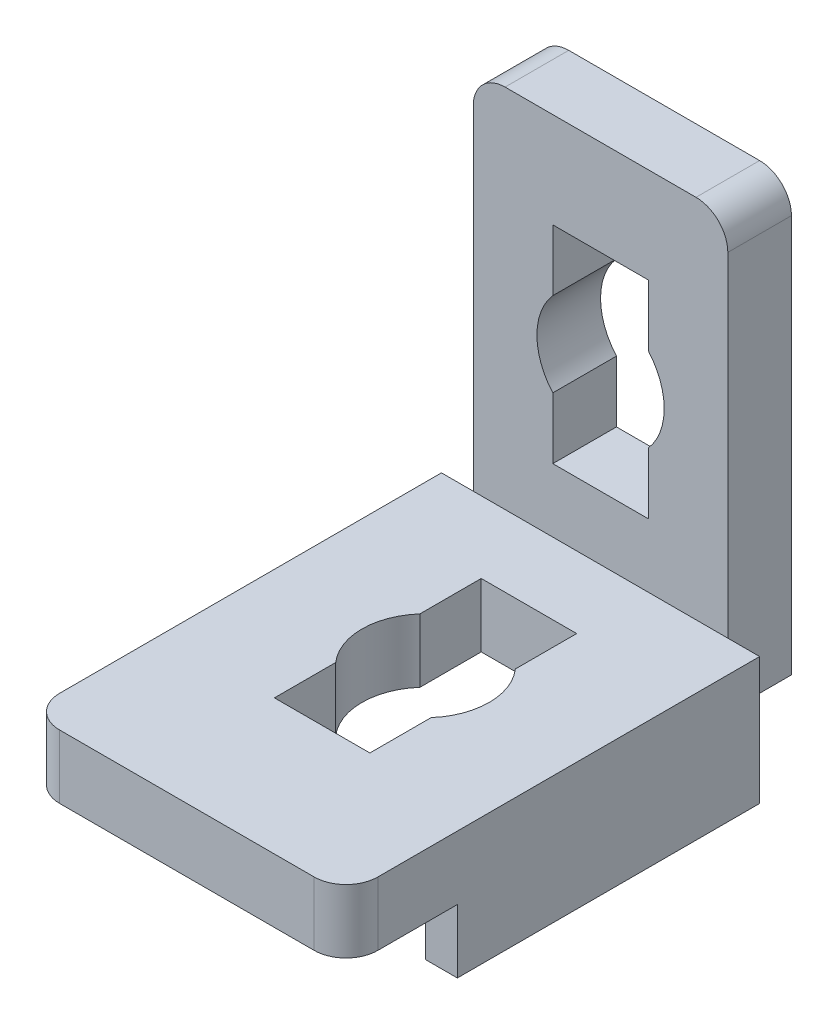
ISO-10303-21;
HEADER;
FILE_DESCRIPTION(('STEP AP214'),'2;1');
FILE_NAME('part.step','',(''),(''),'','','');
FILE_SCHEMA(('AUTOMOTIVE_DESIGN { 1 0 10303 214 1 1 1 1 }'));
ENDSEC;
DATA;
#1=APPLICATION_CONTEXT('core data for automotive mechanical design processes');
#2=APPLICATION_PROTOCOL_DEFINITION('international standard','automotive_design',2000,#1);
#3=PRODUCT_CONTEXT('',#1,'mechanical');
#4=PRODUCT('Part','Part','',(#3));
#5=PRODUCT_RELATED_PRODUCT_CATEGORY('part','',(#4));
#6=PRODUCT_DEFINITION_FORMATION('','',#4);
#7=PRODUCT_DEFINITION_CONTEXT('part definition',#1,'design');
#8=PRODUCT_DEFINITION('design','',#6,#7);
#9=PRODUCT_DEFINITION_SHAPE('','',#8);
#10=(LENGTH_UNIT() NAMED_UNIT(*) SI_UNIT(.MILLI.,.METRE.));
#11=(NAMED_UNIT(*) PLANE_ANGLE_UNIT() SI_UNIT($,.RADIAN.));
#12=(NAMED_UNIT(*) SI_UNIT($,.STERADIAN.) SOLID_ANGLE_UNIT());
#13=UNCERTAINTY_MEASURE_WITH_UNIT(LENGTH_MEASURE(1.E-05),#10,'distance_accuracy_value','');
#14=(GEOMETRIC_REPRESENTATION_CONTEXT(3) GLOBAL_UNCERTAINTY_ASSIGNED_CONTEXT((#13)) GLOBAL_UNIT_ASSIGNED_CONTEXT((#10,
#11,#12)) REPRESENTATION_CONTEXT('',''));
#15=CARTESIAN_POINT('',(0.,0.,0.));
#16=DIRECTION('',(0.,0.,1.));
#17=DIRECTION('',(1.,0.,0.));
#18=AXIS2_PLACEMENT_3D('',#15,#16,#17);
#19=CARTESIAN_POINT('',(-4.,0.,2.));
#20=DIRECTION('',(0.,1.,0.));
#21=DIRECTION('',(0.,0.,1.));
#22=AXIS2_PLACEMENT_3D('',#19,#20,#21);
#23=PLANE('',#22);
#24=DIRECTION('',(0.,0.,1.));
#25=VECTOR('',#24,1.);
#26=CARTESIAN_POINT('',(1.5,0.,8.82287565553229));
#27=LINE('',#26,#25);
#28=CARTESIAN_POINT('',(1.5,0.,8.82287565553229));
#29=VERTEX_POINT('',#28);
#30=CARTESIAN_POINT('',(1.5,0.,10.75));
#31=VERTEX_POINT('',#30);
#32=EDGE_CURVE('E343',#29,#31,#27,.T.);
#33=ORIENTED_EDGE('',*,*,#32,.F.);
#34=CARTESIAN_POINT('',(0.,0.,7.5));
#35=DIRECTION('',(0.,-1.,0.));
#36=DIRECTION('',(0.,0.,-1.));
#37=AXIS2_PLACEMENT_3D('',#34,#35,#36);
#38=CIRCLE('',#37,2.);
#39=CARTESIAN_POINT('',(1.5,0.,6.17712434446771));
#40=VERTEX_POINT('',#39);
#41=EDGE_CURVE('E341',#40,#29,#38,.T.);
#42=ORIENTED_EDGE('',*,*,#41,.F.);
#43=DIRECTION('',(0.,0.,1.));
#44=VECTOR('',#43,1.);
#45=CARTESIAN_POINT('',(1.5,0.,4.25));
#46=LINE('',#45,#44);
#47=CARTESIAN_POINT('',(1.5,0.,4.25));
#48=VERTEX_POINT('',#47);
#49=EDGE_CURVE('E361',#48,#40,#46,.T.);
#50=ORIENTED_EDGE('',*,*,#49,.F.);
#51=DIRECTION('',(1.,0.,0.));
#52=VECTOR('',#51,1.);
#53=CARTESIAN_POINT('',(-1.5,0.,4.25));
#54=LINE('',#53,#52);
#55=CARTESIAN_POINT('',(-1.5,0.,4.25));
#56=VERTEX_POINT('',#55);
#57=EDGE_CURVE('E358',#56,#48,#54,.T.);
#58=ORIENTED_EDGE('',*,*,#57,.F.);
#59=DIRECTION('',(0.,0.,-1.));
#60=VECTOR('',#59,1.);
#61=CARTESIAN_POINT('',(-1.5,0.,4.25));
#62=LINE('',#61,#60);
#63=CARTESIAN_POINT('',(-1.5,0.,6.1771243444677));
#64=VERTEX_POINT('',#63);
#65=EDGE_CURVE('E355',#64,#56,#62,.T.);
#66=ORIENTED_EDGE('',*,*,#65,.F.);
#67=CARTESIAN_POINT('',(0.,0.,7.5));
#68=DIRECTION('',(0.,-1.,0.));
#69=DIRECTION('',(0.,0.,-1.));
#70=AXIS2_PLACEMENT_3D('',#67,#68,#69);
#71=CIRCLE('',#70,2.);
#72=CARTESIAN_POINT('',(-1.5,0.,8.8228756555323));
#73=VERTEX_POINT('',#72);
#74=EDGE_CURVE('E352',#73,#64,#71,.T.);
#75=ORIENTED_EDGE('',*,*,#74,.F.);
#76=DIRECTION('',(0.,0.,-1.));
#77=VECTOR('',#76,1.);
#78=CARTESIAN_POINT('',(-1.5,0.,8.8228756555323));
#79=LINE('',#78,#77);
#80=CARTESIAN_POINT('',(-1.5,0.,10.75));
#81=VERTEX_POINT('',#80);
#82=EDGE_CURVE('E349',#81,#73,#79,.T.);
#83=ORIENTED_EDGE('',*,*,#82,.F.);
#84=DIRECTION('',(-1.,0.,0.));
#85=VECTOR('',#84,1.);
#86=CARTESIAN_POINT('',(-1.5,0.,10.75));
#87=LINE('',#86,#85);
#88=EDGE_CURVE('E346',#31,#81,#87,.T.);
#89=ORIENTED_EDGE('',*,*,#88,.F.);
#90=EDGE_LOOP('',(#33,#42,#50,#58,#66,#75,#83,#89));
#91=FACE_BOUND('',#90,.T.);
#92=DIRECTION('',(-1.,0.,0.));
#93=VECTOR('',#92,1.);
#94=CARTESIAN_POINT('',(-5.,0.,15.));
#95=LINE('',#94,#93);
#96=CARTESIAN_POINT('',(4.,0.,15.));
#97=VERTEX_POINT('',#96);
#98=CARTESIAN_POINT('',(-4.,0.,15.));
#99=VERTEX_POINT('',#98);
#100=EDGE_CURVE('E447',#97,#99,#95,.T.);
#101=ORIENTED_EDGE('',*,*,#100,.T.);
#102=CARTESIAN_POINT('',(-4.,0.,14.));
#103=DIRECTION('',(0.,1.,0.));
#104=DIRECTION('',(0.,0.,1.));
#105=AXIS2_PLACEMENT_3D('',#102,#103,#104);
#106=CIRCLE('',#105,1.);
#107=CARTESIAN_POINT('',(-5.,0.,14.));
#108=VERTEX_POINT('',#107);
#109=EDGE_CURVE('E558',#99,#108,#106,.F.);
#110=ORIENTED_EDGE('',*,*,#109,.T.);
#111=DIRECTION('',(0.,0.,-1.));
#112=VECTOR('',#111,1.);
#113=CARTESIAN_POINT('',(-5.,0.,2.));
#114=LINE('',#113,#112);
#115=CARTESIAN_POINT('',(-5.,0.,11.5));
#116=VERTEX_POINT('',#115);
#117=EDGE_CURVE('E443',#108,#116,#114,.T.);
#118=ORIENTED_EDGE('',*,*,#117,.T.);
#119=DIRECTION('',(-1.,0.,0.));
#120=VECTOR('',#119,1.);
#121=CARTESIAN_POINT('',(-5.,0.,11.5));
#122=LINE('',#121,#120);
#123=CARTESIAN_POINT('',(-4.,0.,11.5));
#124=VERTEX_POINT('',#123);
#125=EDGE_CURVE('E414',#124,#116,#122,.T.);
#126=ORIENTED_EDGE('',*,*,#125,.F.);
#127=DIRECTION('',(0.,0.,1.));
#128=VECTOR('',#127,1.);
#129=CARTESIAN_POINT('',(-4.,0.,2.));
#130=LINE('',#129,#128);
#131=CARTESIAN_POINT('',(-4.,0.,2.));
#132=VERTEX_POINT('',#131);
#133=EDGE_CURVE('E409',#132,#124,#130,.T.);
#134=ORIENTED_EDGE('',*,*,#133,.F.);
#135=DIRECTION('',(0.,0.,-1.));
#136=VECTOR('',#135,1.);
#137=CARTESIAN_POINT('',(-4.,0.,2.));
#138=LINE('',#137,#136);
#139=CARTESIAN_POINT('',(-4.,0.,0.));
#140=VERTEX_POINT('',#139);
#141=EDGE_CURVE('E431',#132,#140,#138,.T.);
#142=ORIENTED_EDGE('',*,*,#141,.T.);
#143=DIRECTION('',(1.,0.,0.));
#144=VECTOR('',#143,1.);
#145=CARTESIAN_POINT('',(-4.,0.,0.));
#146=LINE('',#145,#144);
#147=CARTESIAN_POINT('',(4.,0.,0.));
#148=VERTEX_POINT('',#147);
#149=EDGE_CURVE('E475',#140,#148,#146,.T.);
#150=ORIENTED_EDGE('',*,*,#149,.T.);
#151=DIRECTION('',(0.,0.,-1.));
#152=VECTOR('',#151,1.);
#153=CARTESIAN_POINT('',(4.,0.,2.));
#154=LINE('',#153,#152);
#155=CARTESIAN_POINT('',(4.,0.,2.));
#156=VERTEX_POINT('',#155);
#157=EDGE_CURVE('E473',#156,#148,#154,.T.);
#158=ORIENTED_EDGE('',*,*,#157,.F.);
#159=DIRECTION('',(0.,0.,-1.));
#160=VECTOR('',#159,1.);
#161=CARTESIAN_POINT('',(4.,0.,2.));
#162=LINE('',#161,#160);
#163=CARTESIAN_POINT('',(4.,0.,11.5));
#164=VERTEX_POINT('',#163);
#165=EDGE_CURVE('E389',#164,#156,#162,.T.);
#166=ORIENTED_EDGE('',*,*,#165,.F.);
#167=DIRECTION('',(-1.,0.,0.));
#168=VECTOR('',#167,1.);
#169=CARTESIAN_POINT('',(5.,0.,11.5));
#170=LINE('',#169,#168);
#171=CARTESIAN_POINT('',(5.,0.,11.5));
#172=VERTEX_POINT('',#171);
#173=EDGE_CURVE('E384',#172,#164,#170,.T.);
#174=ORIENTED_EDGE('',*,*,#173,.F.);
#175=DIRECTION('',(0.,0.,1.));
#176=VECTOR('',#175,1.);
#177=CARTESIAN_POINT('',(5.,0.,2.));
#178=LINE('',#177,#176);
#179=CARTESIAN_POINT('',(5.,0.,14.));
#180=VERTEX_POINT('',#179);
#181=EDGE_CURVE('E508',#172,#180,#178,.T.);
#182=ORIENTED_EDGE('',*,*,#181,.T.);
#183=CARTESIAN_POINT('',(4.,0.,14.));
#184=DIRECTION('',(0.,1.,0.));
#185=DIRECTION('',(0.,0.,1.));
#186=AXIS2_PLACEMENT_3D('',#183,#184,#185);
#187=CIRCLE('',#186,1.);
#188=EDGE_CURVE('E442',#180,#97,#187,.F.);
#189=ORIENTED_EDGE('',*,*,#188,.T.);
#190=EDGE_LOOP('',(#101,#110,#118,#126,#134,#142,#150,#158,#166,#174,#182,#189));
#191=FACE_BOUND('',#190,.T.);
#192=ADVANCED_FACE('F34',(#91,#191),#23,.F.);
#193=CARTESIAN_POINT('',(-4.,0.,2.));
#194=DIRECTION('',(1.,0.,0.));
#195=DIRECTION('',(0.,0.,-1.));
#196=AXIS2_PLACEMENT_3D('',#193,#194,#195);
#197=PLANE('',#196);
#198=DIRECTION('',(0.,-1.,0.));
#199=VECTOR('',#198,1.);
#200=CARTESIAN_POINT('',(-4.,0.,2.));
#201=LINE('',#200,#199);
#202=CARTESIAN_POINT('',(-4.,12.5,2.));
#203=VERTEX_POINT('',#202);
#204=CARTESIAN_POINT('',(-4.,2.,2.));
#205=VERTEX_POINT('',#204);
#206=EDGE_CURVE('E464',#203,#205,#201,.T.);
#207=ORIENTED_EDGE('',*,*,#206,.F.);
#208=DIRECTION('',(0.,0.,-1.));
#209=VECTOR('',#208,1.);
#210=CARTESIAN_POINT('',(-4.,12.5,2.));
#211=LINE('',#210,#209);
#212=CARTESIAN_POINT('',(-4.,12.5,0.));
#213=VERTEX_POINT('',#212);
#214=EDGE_CURVE('E572',#203,#213,#211,.T.);
#215=ORIENTED_EDGE('',*,*,#214,.T.);
#216=DIRECTION('',(0.,-1.,0.));
#217=VECTOR('',#216,1.);
#218=CARTESIAN_POINT('',(-4.,0.,0.));
#219=LINE('',#218,#217);
#220=EDGE_CURVE('E463',#213,#140,#219,.T.);
#221=ORIENTED_EDGE('',*,*,#220,.T.);
#222=ORIENTED_EDGE('',*,*,#141,.F.);
#223=DIRECTION('',(0.,-1.,0.));
#224=VECTOR('',#223,1.);
#225=CARTESIAN_POINT('',(-4.,2.,2.));
#226=LINE('',#225,#224);
#227=EDGE_CURVE('E453',#205,#132,#226,.T.);
#228=ORIENTED_EDGE('',*,*,#227,.F.);
#229=EDGE_LOOP('',(#207,#215,#221,#222,#228));
#230=FACE_BOUND('',#229,.T.);
#231=ADVANCED_FACE('F490',(#230),#197,.F.);
#232=CARTESIAN_POINT('',(4.,0.,2.));
#233=DIRECTION('',(-1.,0.,0.));
#234=DIRECTION('',(0.,0.,1.));
#235=AXIS2_PLACEMENT_3D('',#232,#233,#234);
#236=PLANE('',#235);
#237=DIRECTION('',(0.,1.,0.));
#238=VECTOR('',#237,1.);
#239=CARTESIAN_POINT('',(4.,0.,0.));
#240=LINE('',#239,#238);
#241=CARTESIAN_POINT('',(4.,12.5,0.));
#242=VERTEX_POINT('',#241);
#243=EDGE_CURVE('E477',#148,#242,#240,.T.);
#244=ORIENTED_EDGE('',*,*,#243,.T.);
#245=DIRECTION('',(0.,0.,-1.));
#246=VECTOR('',#245,1.);
#247=CARTESIAN_POINT('',(4.,12.5,2.));
#248=LINE('',#247,#246);
#249=CARTESIAN_POINT('',(4.,12.5,2.));
#250=VERTEX_POINT('',#249);
#251=EDGE_CURVE('E11',#242,#250,#248,.F.);
#252=ORIENTED_EDGE('',*,*,#251,.T.);
#253=DIRECTION('',(0.,1.,0.));
#254=VECTOR('',#253,1.);
#255=CARTESIAN_POINT('',(4.,0.,2.));
#256=LINE('',#255,#254);
#257=CARTESIAN_POINT('',(4.,2.,2.));
#258=VERTEX_POINT('',#257);
#259=EDGE_CURVE('E466',#258,#250,#256,.T.);
#260=ORIENTED_EDGE('',*,*,#259,.F.);
#261=EDGE_CURVE('E468',#156,#258,#256,.T.);
#262=ORIENTED_EDGE('',*,*,#261,.F.);
#263=ORIENTED_EDGE('',*,*,#157,.T.);
#264=EDGE_LOOP('',(#244,#252,#260,#262,#263));
#265=FACE_BOUND('',#264,.T.);
#266=ADVANCED_FACE('F536',(#265),#236,.F.);
#267=CARTESIAN_POINT('',(-4.,13.5,2.));
#268=DIRECTION('',(0.,-1.,0.));
#269=DIRECTION('',(0.,0.,-1.));
#270=AXIS2_PLACEMENT_3D('',#267,#268,#269);
#271=PLANE('',#270);
#272=DIRECTION('',(-1.,0.,0.));
#273=VECTOR('',#272,1.);
#274=CARTESIAN_POINT('',(-4.,13.5,0.));
#275=LINE('',#274,#273);
#276=CARTESIAN_POINT('',(3.,13.5,0.));
#277=VERTEX_POINT('',#276);
#278=CARTESIAN_POINT('',(-3.,13.5,0.));
#279=VERTEX_POINT('',#278);
#280=EDGE_CURVE('E467',#277,#279,#275,.T.);
#281=ORIENTED_EDGE('',*,*,#280,.T.);
#282=DIRECTION('',(0.,0.,-1.));
#283=VECTOR('',#282,1.);
#284=CARTESIAN_POINT('',(-3.,13.5,2.));
#285=LINE('',#284,#283);
#286=CARTESIAN_POINT('',(-3.,13.5,2.));
#287=VERTEX_POINT('',#286);
#288=EDGE_CURVE('E55',#279,#287,#285,.F.);
#289=ORIENTED_EDGE('',*,*,#288,.T.);
#290=DIRECTION('',(-1.,0.,0.));
#291=VECTOR('',#290,1.);
#292=CARTESIAN_POINT('',(-4.,13.5,2.));
#293=LINE('',#292,#291);
#294=CARTESIAN_POINT('',(3.,13.5,2.));
#295=VERTEX_POINT('',#294);
#296=EDGE_CURVE('E471',#295,#287,#293,.T.);
#297=ORIENTED_EDGE('',*,*,#296,.F.);
#298=DIRECTION('',(0.,0.,-1.));
#299=VECTOR('',#298,1.);
#300=CARTESIAN_POINT('',(3.,13.5,2.));
#301=LINE('',#300,#299);
#302=EDGE_CURVE('E578',#295,#277,#301,.T.);
#303=ORIENTED_EDGE('',*,*,#302,.T.);
#304=EDGE_LOOP('',(#281,#289,#297,#303));
#305=FACE_BOUND('',#304,.T.);
#306=ADVANCED_FACE('F588',(#305),#271,.F.);
#307=CARTESIAN_POINT('',(0.,0.,2.));
#308=DIRECTION('',(0.,0.,-1.));
#309=DIRECTION('',(-1.,0.,0.));
#310=AXIS2_PLACEMENT_3D('',#307,#308,#309);
#311=PLANE('',#310);
#312=DIRECTION('',(0.,-1.,0.));
#313=VECTOR('',#312,1.);
#314=CARTESIAN_POINT('',(-1.5,4.,2.));
#315=LINE('',#314,#313);
#316=CARTESIAN_POINT('',(-1.5,5.92712434446771,2.));
#317=VERTEX_POINT('',#316);
#318=CARTESIAN_POINT('',(-1.5,4.,2.));
#319=VERTEX_POINT('',#318);
#320=EDGE_CURVE('E285',#317,#319,#315,.T.);
#321=ORIENTED_EDGE('',*,*,#320,.F.);
#322=CARTESIAN_POINT('',(0.,7.25,2.));
#323=DIRECTION('',(0.,0.,1.));
#324=DIRECTION('',(1.,0.,0.));
#325=AXIS2_PLACEMENT_3D('',#322,#323,#324);
#326=CIRCLE('',#325,2.);
#327=CARTESIAN_POINT('',(-1.5,8.57287565553229,2.));
#328=VERTEX_POINT('',#327);
#329=EDGE_CURVE('E276',#328,#317,#326,.T.);
#330=ORIENTED_EDGE('',*,*,#329,.F.);
#331=DIRECTION('',(0.,-1.,0.));
#332=VECTOR('',#331,1.);
#333=CARTESIAN_POINT('',(-1.5,8.57287565553229,2.));
#334=LINE('',#333,#332);
#335=CARTESIAN_POINT('',(-1.5,10.5,2.));
#336=VERTEX_POINT('',#335);
#337=EDGE_CURVE('E277',#336,#328,#334,.T.);
#338=ORIENTED_EDGE('',*,*,#337,.F.);
#339=DIRECTION('',(-1.,0.,0.));
#340=VECTOR('',#339,1.);
#341=CARTESIAN_POINT('',(-1.5,10.5,2.));
#342=LINE('',#341,#340);
#343=CARTESIAN_POINT('',(1.5,10.5,2.));
#344=VERTEX_POINT('',#343);
#345=EDGE_CURVE('E304',#344,#336,#342,.T.);
#346=ORIENTED_EDGE('',*,*,#345,.F.);
#347=DIRECTION('',(0.,1.,0.));
#348=VECTOR('',#347,1.);
#349=CARTESIAN_POINT('',(1.5,8.57287565553229,2.));
#350=LINE('',#349,#348);
#351=CARTESIAN_POINT('',(1.5,8.57287565553229,2.));
#352=VERTEX_POINT('',#351);
#353=EDGE_CURVE('E301',#352,#344,#350,.T.);
#354=ORIENTED_EDGE('',*,*,#353,.F.);
#355=CARTESIAN_POINT('',(0.,7.25,2.));
#356=DIRECTION('',(0.,0.,1.));
#357=DIRECTION('',(1.,0.,0.));
#358=AXIS2_PLACEMENT_3D('',#355,#356,#357);
#359=CIRCLE('',#358,2.);
#360=CARTESIAN_POINT('',(1.5,5.92712434446771,2.));
#361=VERTEX_POINT('',#360);
#362=EDGE_CURVE('E298',#361,#352,#359,.T.);
#363=ORIENTED_EDGE('',*,*,#362,.F.);
#364=DIRECTION('',(0.,1.,0.));
#365=VECTOR('',#364,1.);
#366=CARTESIAN_POINT('',(1.5,4.,2.));
#367=LINE('',#366,#365);
#368=CARTESIAN_POINT('',(1.5,4.,2.));
#369=VERTEX_POINT('',#368);
#370=EDGE_CURVE('E295',#369,#361,#367,.T.);
#371=ORIENTED_EDGE('',*,*,#370,.F.);
#372=DIRECTION('',(1.,0.,0.));
#373=VECTOR('',#372,1.);
#374=CARTESIAN_POINT('',(-1.5,4.,2.));
#375=LINE('',#374,#373);
#376=EDGE_CURVE('E292',#319,#369,#375,.T.);
#377=ORIENTED_EDGE('',*,*,#376,.F.);
#378=EDGE_LOOP('',(#321,#330,#338,#346,#354,#363,#371,#377));
#379=FACE_BOUND('',#378,.T.);
#380=ORIENTED_EDGE('',*,*,#296,.T.);
#381=CARTESIAN_POINT('',(-3.,12.5,2.));
#382=DIRECTION('',(0.,0.,-1.));
#383=DIRECTION('',(-1.,0.,0.));
#384=AXIS2_PLACEMENT_3D('',#381,#382,#383);
#385=CIRCLE('',#384,1.);
#386=EDGE_CURVE('E42',#287,#203,#385,.F.);
#387=ORIENTED_EDGE('',*,*,#386,.T.);
#388=ORIENTED_EDGE('',*,*,#206,.T.);
#389=DIRECTION('',(1.,0.,0.));
#390=VECTOR('',#389,1.);
#391=CARTESIAN_POINT('',(0.,2.,2.));
#392=LINE('',#391,#390);
#393=EDGE_CURVE('E456',#205,#258,#392,.T.);
#394=ORIENTED_EDGE('',*,*,#393,.T.);
#395=ORIENTED_EDGE('',*,*,#259,.T.);
#396=CARTESIAN_POINT('',(3.,12.5,2.));
#397=DIRECTION('',(0.,0.,-1.));
#398=DIRECTION('',(-1.,0.,0.));
#399=AXIS2_PLACEMENT_3D('',#396,#397,#398);
#400=CIRCLE('',#399,1.);
#401=EDGE_CURVE('E582',#250,#295,#400,.F.);
#402=ORIENTED_EDGE('',*,*,#401,.T.);
#403=EDGE_LOOP('',(#380,#387,#388,#394,#395,#402));
#404=FACE_BOUND('',#403,.T.);
#405=ADVANCED_FACE('F534',(#379,#404),#311,.F.);
#406=CARTESIAN_POINT('',(0.,0.,0.));
#407=DIRECTION('',(0.,0.,-1.));
#408=DIRECTION('',(-1.,0.,0.));
#409=AXIS2_PLACEMENT_3D('',#406,#407,#408);
#410=PLANE('',#409);
#411=CARTESIAN_POINT('',(0.,7.25,0.));
#412=DIRECTION('',(0.,0.,-1.));
#413=DIRECTION('',(-1.,0.,0.));
#414=AXIS2_PLACEMENT_3D('',#411,#412,#413);
#415=CIRCLE('',#414,2.);
#416=CARTESIAN_POINT('',(-1.5,8.57287565553229,0.));
#417=VERTEX_POINT('',#416);
#418=CARTESIAN_POINT('',(-1.5,5.92712434446771,0.));
#419=VERTEX_POINT('',#418);
#420=EDGE_CURVE('E273',#417,#419,#415,.F.);
#421=ORIENTED_EDGE('',*,*,#420,.T.);
#422=DIRECTION('',(0.,-1.,0.));
#423=VECTOR('',#422,1.);
#424=CARTESIAN_POINT('',(-1.5,4.,0.));
#425=LINE('',#424,#423);
#426=CARTESIAN_POINT('',(-1.5,4.,0.));
#427=VERTEX_POINT('',#426);
#428=EDGE_CURVE('E257',#419,#427,#425,.T.);
#429=ORIENTED_EDGE('',*,*,#428,.T.);
#430=DIRECTION('',(1.,0.,0.));
#431=VECTOR('',#430,1.);
#432=CARTESIAN_POINT('',(-1.5,4.,0.));
#433=LINE('',#432,#431);
#434=CARTESIAN_POINT('',(1.5,4.,0.));
#435=VERTEX_POINT('',#434);
#436=EDGE_CURVE('E968',#427,#435,#433,.T.);
#437=ORIENTED_EDGE('',*,*,#436,.T.);
#438=DIRECTION('',(0.,1.,0.));
#439=VECTOR('',#438,1.);
#440=CARTESIAN_POINT('',(1.5,4.,0.));
#441=LINE('',#440,#439);
#442=CARTESIAN_POINT('',(1.5,5.92712434446771,0.));
#443=VERTEX_POINT('',#442);
#444=EDGE_CURVE('E970',#435,#443,#441,.T.);
#445=ORIENTED_EDGE('',*,*,#444,.T.);
#446=CARTESIAN_POINT('',(0.,7.25,0.));
#447=DIRECTION('',(0.,0.,-1.));
#448=DIRECTION('',(-1.,0.,0.));
#449=AXIS2_PLACEMENT_3D('',#446,#447,#448);
#450=CIRCLE('',#449,2.);
#451=CARTESIAN_POINT('',(1.5,8.57287565553229,0.));
#452=VERTEX_POINT('',#451);
#453=EDGE_CURVE('E972',#443,#452,#450,.F.);
#454=ORIENTED_EDGE('',*,*,#453,.T.);
#455=DIRECTION('',(0.,1.,0.));
#456=VECTOR('',#455,1.);
#457=CARTESIAN_POINT('',(1.5,8.57287565553229,0.));
#458=LINE('',#457,#456);
#459=CARTESIAN_POINT('',(1.5,10.5,0.));
#460=VERTEX_POINT('',#459);
#461=EDGE_CURVE('E977',#452,#460,#458,.T.);
#462=ORIENTED_EDGE('',*,*,#461,.T.);
#463=DIRECTION('',(-1.,0.,0.));
#464=VECTOR('',#463,1.);
#465=CARTESIAN_POINT('',(-1.5,10.5,0.));
#466=LINE('',#465,#464);
#467=CARTESIAN_POINT('',(-1.5,10.5,0.));
#468=VERTEX_POINT('',#467);
#469=EDGE_CURVE('E287',#460,#468,#466,.T.);
#470=ORIENTED_EDGE('',*,*,#469,.T.);
#471=DIRECTION('',(0.,-1.,0.));
#472=VECTOR('',#471,1.);
#473=CARTESIAN_POINT('',(-1.5,8.57287565553229,0.));
#474=LINE('',#473,#472);
#475=EDGE_CURVE('E283',#468,#417,#474,.T.);
#476=ORIENTED_EDGE('',*,*,#475,.T.);
#477=EDGE_LOOP('',(#421,#429,#437,#445,#454,#462,#470,#476));
#478=FACE_BOUND('',#477,.T.);
#479=ORIENTED_EDGE('',*,*,#220,.F.);
#480=CARTESIAN_POINT('',(-3.,12.5,0.));
#481=DIRECTION('',(0.,0.,-1.));
#482=DIRECTION('',(-1.,0.,0.));
#483=AXIS2_PLACEMENT_3D('',#480,#481,#482);
#484=CIRCLE('',#483,1.);
#485=EDGE_CURVE('E576',#213,#279,#484,.T.);
#486=ORIENTED_EDGE('',*,*,#485,.T.);
#487=ORIENTED_EDGE('',*,*,#280,.F.);
#488=CARTESIAN_POINT('',(3.,12.5,0.));
#489=DIRECTION('',(0.,0.,-1.));
#490=DIRECTION('',(-1.,0.,0.));
#491=AXIS2_PLACEMENT_3D('',#488,#489,#490);
#492=CIRCLE('',#491,1.);
#493=EDGE_CURVE('E574',#277,#242,#492,.T.);
#494=ORIENTED_EDGE('',*,*,#493,.T.);
#495=ORIENTED_EDGE('',*,*,#243,.F.);
#496=ORIENTED_EDGE('',*,*,#149,.F.);
#497=EDGE_LOOP('',(#479,#486,#487,#494,#495,#496));
#498=FACE_BOUND('',#497,.T.);
#499=ADVANCED_FACE('F280',(#478,#498),#410,.T.);
#500=CARTESIAN_POINT('',(0.,2.,0.));
#501=DIRECTION('',(0.,1.,0.));
#502=DIRECTION('',(0.,0.,1.));
#503=AXIS2_PLACEMENT_3D('',#500,#501,#502);
#504=PLANE('',#503);
#505=CARTESIAN_POINT('',(0.,2.,7.5));
#506=DIRECTION('',(0.,1.,0.));
#507=DIRECTION('',(0.,0.,1.));
#508=AXIS2_PLACEMENT_3D('',#505,#506,#507);
#509=CIRCLE('',#508,2.);
#510=CARTESIAN_POINT('',(1.5,2.,6.17712434446771));
#511=VERTEX_POINT('',#510);
#512=CARTESIAN_POINT('',(1.5,2.,8.82287565553229));
#513=VERTEX_POINT('',#512);
#514=EDGE_CURVE('E338',#511,#513,#509,.F.);
#515=ORIENTED_EDGE('',*,*,#514,.T.);
#516=DIRECTION('',(0.,0.,1.));
#517=VECTOR('',#516,1.);
#518=CARTESIAN_POINT('',(1.5,2.,8.82287565553229));
#519=LINE('',#518,#517);
#520=CARTESIAN_POINT('',(1.5,2.,10.75));
#521=VERTEX_POINT('',#520);
#522=EDGE_CURVE('E367',#513,#521,#519,.T.);
#523=ORIENTED_EDGE('',*,*,#522,.T.);
#524=DIRECTION('',(-1.,0.,0.));
#525=VECTOR('',#524,1.);
#526=CARTESIAN_POINT('',(-1.5,2.,10.75));
#527=LINE('',#526,#525);
#528=CARTESIAN_POINT('',(-1.5,2.,10.75));
#529=VERTEX_POINT('',#528);
#530=EDGE_CURVE('E268',#521,#529,#527,.T.);
#531=ORIENTED_EDGE('',*,*,#530,.T.);
#532=DIRECTION('',(0.,0.,-1.));
#533=VECTOR('',#532,1.);
#534=CARTESIAN_POINT('',(-1.5,2.,8.8228756555323));
#535=LINE('',#534,#533);
#536=CARTESIAN_POINT('',(-1.5,2.,8.8228756555323));
#537=VERTEX_POINT('',#536);
#538=EDGE_CURVE('E323',#529,#537,#535,.T.);
#539=ORIENTED_EDGE('',*,*,#538,.T.);
#540=CARTESIAN_POINT('',(0.,2.,7.5));
#541=DIRECTION('',(0.,1.,0.));
#542=DIRECTION('',(0.,0.,1.));
#543=AXIS2_PLACEMENT_3D('',#540,#541,#542);
#544=CIRCLE('',#543,2.);
#545=CARTESIAN_POINT('',(-1.5,2.,6.1771243444677));
#546=VERTEX_POINT('',#545);
#547=EDGE_CURVE('E326',#537,#546,#544,.F.);
#548=ORIENTED_EDGE('',*,*,#547,.T.);
#549=DIRECTION('',(0.,0.,-1.));
#550=VECTOR('',#549,1.);
#551=CARTESIAN_POINT('',(-1.5,2.,4.25));
#552=LINE('',#551,#550);
#553=CARTESIAN_POINT('',(-1.5,2.,4.25));
#554=VERTEX_POINT('',#553);
#555=EDGE_CURVE('E329',#546,#554,#552,.T.);
#556=ORIENTED_EDGE('',*,*,#555,.T.);
#557=DIRECTION('',(1.,0.,0.));
#558=VECTOR('',#557,1.);
#559=CARTESIAN_POINT('',(-1.5,2.,4.25));
#560=LINE('',#559,#558);
#561=CARTESIAN_POINT('',(1.5,2.,4.25));
#562=VERTEX_POINT('',#561);
#563=EDGE_CURVE('E332',#554,#562,#560,.T.);
#564=ORIENTED_EDGE('',*,*,#563,.T.);
#565=DIRECTION('',(0.,0.,1.));
#566=VECTOR('',#565,1.);
#567=CARTESIAN_POINT('',(1.5,2.,4.25));
#568=LINE('',#567,#566);
#569=EDGE_CURVE('E335',#562,#511,#568,.T.);
#570=ORIENTED_EDGE('',*,*,#569,.T.);
#571=EDGE_LOOP('',(#515,#523,#531,#539,#548,#556,#564,#570));
#572=FACE_BOUND('',#571,.T.);
#573=DIRECTION('',(0.,0.,-1.));
#574=VECTOR('',#573,1.);
#575=CARTESIAN_POINT('',(-5.,2.,2.));
#576=LINE('',#575,#574);
#577=CARTESIAN_POINT('',(-5.,2.,14.));
#578=VERTEX_POINT('',#577);
#579=CARTESIAN_POINT('',(-5.,2.,2.));
#580=VERTEX_POINT('',#579);
#581=EDGE_CURVE('E519',#578,#580,#576,.T.);
#582=ORIENTED_EDGE('',*,*,#581,.F.);
#583=CARTESIAN_POINT('',(-4.,2.,14.));
#584=DIRECTION('',(0.,1.,0.));
#585=DIRECTION('',(0.,0.,1.));
#586=AXIS2_PLACEMENT_3D('',#583,#584,#585);
#587=CIRCLE('',#586,1.);
#588=CARTESIAN_POINT('',(-4.,2.,15.));
#589=VERTEX_POINT('',#588);
#590=EDGE_CURVE('E566',#578,#589,#587,.T.);
#591=ORIENTED_EDGE('',*,*,#590,.T.);
#592=DIRECTION('',(-1.,0.,0.));
#593=VECTOR('',#592,1.);
#594=CARTESIAN_POINT('',(-5.,2.,15.));
#595=LINE('',#594,#593);
#596=CARTESIAN_POINT('',(4.,2.,15.));
#597=VERTEX_POINT('',#596);
#598=EDGE_CURVE('E516',#597,#589,#595,.T.);
#599=ORIENTED_EDGE('',*,*,#598,.F.);
#600=CARTESIAN_POINT('',(4.,2.,14.));
#601=DIRECTION('',(0.,1.,0.));
#602=DIRECTION('',(0.,0.,1.));
#603=AXIS2_PLACEMENT_3D('',#600,#601,#602);
#604=CIRCLE('',#603,1.);
#605=CARTESIAN_POINT('',(5.,2.,14.));
#606=VERTEX_POINT('',#605);
#607=EDGE_CURVE('E565',#597,#606,#604,.T.);
#608=ORIENTED_EDGE('',*,*,#607,.T.);
#609=DIRECTION('',(0.,0.,1.));
#610=VECTOR('',#609,1.);
#611=CARTESIAN_POINT('',(5.,2.,2.));
#612=LINE('',#611,#610);
#613=CARTESIAN_POINT('',(5.,2.,2.));
#614=VERTEX_POINT('',#613);
#615=EDGE_CURVE('E513',#614,#606,#612,.T.);
#616=ORIENTED_EDGE('',*,*,#615,.F.);
#617=DIRECTION('',(1.,0.,0.));
#618=VECTOR('',#617,1.);
#619=CARTESIAN_POINT('',(4.,2.,2.));
#620=LINE('',#619,#618);
#621=EDGE_CURVE('E446',#258,#614,#620,.T.);
#622=ORIENTED_EDGE('',*,*,#621,.F.);
#623=ORIENTED_EDGE('',*,*,#393,.F.);
#624=DIRECTION('',(1.,0.,0.));
#625=VECTOR('',#624,1.);
#626=CARTESIAN_POINT('',(-5.,2.,2.));
#627=LINE('',#626,#625);
#628=EDGE_CURVE('E461',#580,#205,#627,.T.);
#629=ORIENTED_EDGE('',*,*,#628,.F.);
#630=EDGE_LOOP('',(#582,#591,#599,#608,#616,#622,#623,#629));
#631=FACE_BOUND('',#630,.T.);
#632=ADVANCED_FACE('F530',(#572,#631),#504,.T.);
#633=CARTESIAN_POINT('',(-5.,2.,2.));
#634=DIRECTION('',(0.,0.,-1.));
#635=DIRECTION('',(-1.,0.,0.));
#636=AXIS2_PLACEMENT_3D('',#633,#634,#635);
#637=PLANE('',#636);
#638=ORIENTED_EDGE('',*,*,#227,.T.);
#639=DIRECTION('',(0.,1.,0.));
#640=VECTOR('',#639,1.);
#641=CARTESIAN_POINT('',(-4.,-2.,2.));
#642=LINE('',#641,#640);
#643=CARTESIAN_POINT('',(-4.,-2.,2.));
#644=VERTEX_POINT('',#643);
#645=EDGE_CURVE('E500',#644,#132,#642,.T.);
#646=ORIENTED_EDGE('',*,*,#645,.F.);
#647=DIRECTION('',(1.,0.,0.));
#648=VECTOR('',#647,1.);
#649=CARTESIAN_POINT('',(-5.,-2.,2.));
#650=LINE('',#649,#648);
#651=CARTESIAN_POINT('',(-5.,-2.,2.));
#652=VERTEX_POINT('',#651);
#653=EDGE_CURVE('E413',#652,#644,#650,.T.);
#654=ORIENTED_EDGE('',*,*,#653,.F.);
#655=DIRECTION('',(0.,-1.,0.));
#656=VECTOR('',#655,1.);
#657=CARTESIAN_POINT('',(-5.,2.,2.));
#658=LINE('',#657,#656);
#659=EDGE_CURVE('E457',#580,#652,#658,.T.);
#660=ORIENTED_EDGE('',*,*,#659,.F.);
#661=ORIENTED_EDGE('',*,*,#628,.T.);
#662=EDGE_LOOP('',(#638,#646,#654,#660,#661));
#663=FACE_BOUND('',#662,.T.);
#664=ADVANCED_FACE('F498',(#663),#637,.T.);
#665=CARTESIAN_POINT('',(-5.,2.,2.));
#666=DIRECTION('',(-1.,0.,0.));
#667=DIRECTION('',(0.,0.,1.));
#668=AXIS2_PLACEMENT_3D('',#665,#666,#667);
#669=PLANE('',#668);
#670=ORIENTED_EDGE('',*,*,#117,.F.);
#671=DIRECTION('',(0.,-1.,0.));
#672=VECTOR('',#671,1.);
#673=CARTESIAN_POINT('',(-5.,2.,14.));
#674=LINE('',#673,#672);
#675=EDGE_CURVE('E527',#108,#578,#674,.F.);
#676=ORIENTED_EDGE('',*,*,#675,.T.);
#677=ORIENTED_EDGE('',*,*,#581,.T.);
#678=ORIENTED_EDGE('',*,*,#659,.T.);
#679=DIRECTION('',(0.,0.,-1.));
#680=VECTOR('',#679,1.);
#681=CARTESIAN_POINT('',(-5.,-2.,2.));
#682=LINE('',#681,#680);
#683=CARTESIAN_POINT('',(-5.,-2.,11.5));
#684=VERTEX_POINT('',#683);
#685=EDGE_CURVE('E410',#684,#652,#682,.T.);
#686=ORIENTED_EDGE('',*,*,#685,.F.);
#687=DIRECTION('',(0.,1.,0.));
#688=VECTOR('',#687,1.);
#689=CARTESIAN_POINT('',(-5.,-2.,11.5));
#690=LINE('',#689,#688);
#691=EDGE_CURVE('E420',#684,#116,#690,.T.);
#692=ORIENTED_EDGE('',*,*,#691,.T.);
#693=EDGE_LOOP('',(#670,#676,#677,#678,#686,#692));
#694=FACE_BOUND('',#693,.T.);
#695=ADVANCED_FACE('F524',(#694),#669,.T.);
#696=CARTESIAN_POINT('',(-5.,2.,15.));
#697=DIRECTION('',(0.,0.,1.));
#698=DIRECTION('',(1.,0.,0.));
#699=AXIS2_PLACEMENT_3D('',#696,#697,#698);
#700=PLANE('',#699);
#701=ORIENTED_EDGE('',*,*,#598,.T.);
#702=DIRECTION('',(0.,-1.,0.));
#703=VECTOR('',#702,1.);
#704=CARTESIAN_POINT('',(-4.,2.,15.));
#705=LINE('',#704,#703);
#706=EDGE_CURVE('E439',#589,#99,#705,.T.);
#707=ORIENTED_EDGE('',*,*,#706,.T.);
#708=ORIENTED_EDGE('',*,*,#100,.F.);
#709=DIRECTION('',(0.,-1.,0.));
#710=VECTOR('',#709,1.);
#711=CARTESIAN_POINT('',(4.,2.,15.));
#712=LINE('',#711,#710);
#713=EDGE_CURVE('E437',#97,#597,#712,.F.);
#714=ORIENTED_EDGE('',*,*,#713,.T.);
#715=EDGE_LOOP('',(#701,#707,#708,#714));
#716=FACE_BOUND('',#715,.T.);
#717=ADVANCED_FACE('F560',(#716),#700,.T.);
#718=CARTESIAN_POINT('',(5.,2.,2.));
#719=DIRECTION('',(1.,0.,0.));
#720=DIRECTION('',(0.,0.,-1.));
#721=AXIS2_PLACEMENT_3D('',#718,#719,#720);
#722=PLANE('',#721);
#723=ORIENTED_EDGE('',*,*,#615,.T.);
#724=DIRECTION('',(0.,-1.,0.));
#725=VECTOR('',#724,1.);
#726=CARTESIAN_POINT('',(5.,2.,14.));
#727=LINE('',#726,#725);
#728=EDGE_CURVE('E554',#606,#180,#727,.T.);
#729=ORIENTED_EDGE('',*,*,#728,.T.);
#730=ORIENTED_EDGE('',*,*,#181,.F.);
#731=DIRECTION('',(0.,1.,0.));
#732=VECTOR('',#731,1.);
#733=CARTESIAN_POINT('',(5.,-2.,11.5));
#734=LINE('',#733,#732);
#735=CARTESIAN_POINT('',(5.,-2.,11.5));
#736=VERTEX_POINT('',#735);
#737=EDGE_CURVE('E406',#736,#172,#734,.T.);
#738=ORIENTED_EDGE('',*,*,#737,.F.);
#739=DIRECTION('',(0.,0.,1.));
#740=VECTOR('',#739,1.);
#741=CARTESIAN_POINT('',(5.,-2.,2.));
#742=LINE('',#741,#740);
#743=CARTESIAN_POINT('',(5.,-2.,2.));
#744=VERTEX_POINT('',#743);
#745=EDGE_CURVE('E385',#744,#736,#742,.T.);
#746=ORIENTED_EDGE('',*,*,#745,.F.);
#747=DIRECTION('',(0.,-1.,0.));
#748=VECTOR('',#747,1.);
#749=CARTESIAN_POINT('',(5.,2.,2.));
#750=LINE('',#749,#748);
#751=EDGE_CURVE('E459',#614,#744,#750,.T.);
#752=ORIENTED_EDGE('',*,*,#751,.F.);
#753=EDGE_LOOP('',(#723,#729,#730,#738,#746,#752));
#754=FACE_BOUND('',#753,.T.);
#755=ADVANCED_FACE('F551',(#754),#722,.T.);
#756=CARTESIAN_POINT('',(4.,2.,2.));
#757=DIRECTION('',(0.,0.,-1.));
#758=DIRECTION('',(-1.,0.,0.));
#759=AXIS2_PLACEMENT_3D('',#756,#757,#758);
#760=PLANE('',#759);
#761=ORIENTED_EDGE('',*,*,#751,.T.);
#762=DIRECTION('',(1.,0.,0.));
#763=VECTOR('',#762,1.);
#764=CARTESIAN_POINT('',(5.,-2.,2.));
#765=LINE('',#764,#763);
#766=CARTESIAN_POINT('',(4.,-2.,2.));
#767=VERTEX_POINT('',#766);
#768=EDGE_CURVE('E393',#767,#744,#765,.T.);
#769=ORIENTED_EDGE('',*,*,#768,.F.);
#770=DIRECTION('',(0.,1.,0.));
#771=VECTOR('',#770,1.);
#772=CARTESIAN_POINT('',(4.,-2.,2.));
#773=LINE('',#772,#771);
#774=EDGE_CURVE('E396',#767,#156,#773,.T.);
#775=ORIENTED_EDGE('',*,*,#774,.T.);
#776=ORIENTED_EDGE('',*,*,#261,.T.);
#777=ORIENTED_EDGE('',*,*,#621,.T.);
#778=EDGE_LOOP('',(#761,#769,#775,#776,#777));
#779=FACE_BOUND('',#778,.T.);
#780=ADVANCED_FACE('F538',(#779),#760,.T.);
#781=CARTESIAN_POINT('',(-4.,-2.,2.));
#782=DIRECTION('',(-1.,0.,0.));
#783=DIRECTION('',(0.,0.,1.));
#784=AXIS2_PLACEMENT_3D('',#781,#782,#783);
#785=PLANE('',#784);
#786=ORIENTED_EDGE('',*,*,#133,.T.);
#787=DIRECTION('',(0.,1.,0.));
#788=VECTOR('',#787,1.);
#789=CARTESIAN_POINT('',(-4.,-2.,11.5));
#790=LINE('',#789,#788);
#791=CARTESIAN_POINT('',(-4.,-2.,11.5));
#792=VERTEX_POINT('',#791);
#793=EDGE_CURVE('E425',#792,#124,#790,.T.);
#794=ORIENTED_EDGE('',*,*,#793,.F.);
#795=DIRECTION('',(0.,0.,1.));
#796=VECTOR('',#795,1.);
#797=CARTESIAN_POINT('',(-4.,-2.,2.));
#798=LINE('',#797,#796);
#799=EDGE_CURVE('E416',#644,#792,#798,.T.);
#800=ORIENTED_EDGE('',*,*,#799,.F.);
#801=ORIENTED_EDGE('',*,*,#645,.T.);
#802=EDGE_LOOP('',(#786,#794,#800,#801));
#803=FACE_BOUND('',#802,.T.);
#804=ADVANCED_FACE('F505',(#803),#785,.F.);
#805=CARTESIAN_POINT('',(-5.,-2.,11.5));
#806=DIRECTION('',(0.,0.,-1.));
#807=DIRECTION('',(-1.,0.,0.));
#808=AXIS2_PLACEMENT_3D('',#805,#806,#807);
#809=PLANE('',#808);
#810=ORIENTED_EDGE('',*,*,#125,.T.);
#811=ORIENTED_EDGE('',*,*,#691,.F.);
#812=DIRECTION('',(-1.,0.,0.));
#813=VECTOR('',#812,1.);
#814=CARTESIAN_POINT('',(-5.,-2.,11.5));
#815=LINE('',#814,#813);
#816=EDGE_CURVE('E418',#792,#684,#815,.T.);
#817=ORIENTED_EDGE('',*,*,#816,.F.);
#818=ORIENTED_EDGE('',*,*,#793,.T.);
#819=EDGE_LOOP('',(#810,#811,#817,#818));
#820=FACE_BOUND('',#819,.T.);
#821=ADVANCED_FACE('F804',(#820),#809,.F.);
#822=CARTESIAN_POINT('',(0.,-2.,0.));
#823=DIRECTION('',(0.,1.,0.));
#824=DIRECTION('',(0.,0.,1.));
#825=AXIS2_PLACEMENT_3D('',#822,#823,#824);
#826=PLANE('',#825);
#827=ORIENTED_EDGE('',*,*,#685,.T.);
#828=ORIENTED_EDGE('',*,*,#653,.T.);
#829=ORIENTED_EDGE('',*,*,#799,.T.);
#830=ORIENTED_EDGE('',*,*,#816,.T.);
#831=EDGE_LOOP('',(#827,#828,#829,#830));
#832=FACE_BOUND('',#831,.T.);
#833=ADVANCED_FACE('F796',(#832),#826,.F.);
#834=CARTESIAN_POINT('',(5.,-2.,11.5));
#835=DIRECTION('',(0.,0.,-1.));
#836=DIRECTION('',(-1.,0.,0.));
#837=AXIS2_PLACEMENT_3D('',#834,#835,#836);
#838=PLANE('',#837);
#839=ORIENTED_EDGE('',*,*,#173,.T.);
#840=DIRECTION('',(0.,1.,0.));
#841=VECTOR('',#840,1.);
#842=CARTESIAN_POINT('',(4.,-2.,11.5));
#843=LINE('',#842,#841);
#844=CARTESIAN_POINT('',(4.,-2.,11.5));
#845=VERTEX_POINT('',#844);
#846=EDGE_CURVE('E403',#845,#164,#843,.T.);
#847=ORIENTED_EDGE('',*,*,#846,.F.);
#848=DIRECTION('',(-1.,0.,0.));
#849=VECTOR('',#848,1.);
#850=CARTESIAN_POINT('',(5.,-2.,11.5));
#851=LINE('',#850,#849);
#852=EDGE_CURVE('E388',#736,#845,#851,.T.);
#853=ORIENTED_EDGE('',*,*,#852,.F.);
#854=ORIENTED_EDGE('',*,*,#737,.T.);
#855=EDGE_LOOP('',(#839,#847,#853,#854));
#856=FACE_BOUND('',#855,.T.);
#857=ADVANCED_FACE('F547',(#856),#838,.F.);
#858=CARTESIAN_POINT('',(4.,-2.,2.));
#859=DIRECTION('',(1.,0.,0.));
#860=DIRECTION('',(0.,0.,-1.));
#861=AXIS2_PLACEMENT_3D('',#858,#859,#860);
#862=PLANE('',#861);
#863=ORIENTED_EDGE('',*,*,#165,.T.);
#864=ORIENTED_EDGE('',*,*,#774,.F.);
#865=DIRECTION('',(0.,0.,-1.));
#866=VECTOR('',#865,1.);
#867=CARTESIAN_POINT('',(4.,-2.,2.));
#868=LINE('',#867,#866);
#869=EDGE_CURVE('E391',#845,#767,#868,.T.);
#870=ORIENTED_EDGE('',*,*,#869,.F.);
#871=ORIENTED_EDGE('',*,*,#846,.T.);
#872=EDGE_LOOP('',(#863,#864,#870,#871));
#873=FACE_BOUND('',#872,.T.);
#874=ADVANCED_FACE('F543',(#873),#862,.F.);
#875=CARTESIAN_POINT('',(0.,-2.,0.));
#876=DIRECTION('',(0.,-1.,0.));
#877=DIRECTION('',(0.,0.,-1.));
#878=AXIS2_PLACEMENT_3D('',#875,#876,#877);
#879=PLANE('',#878);
#880=ORIENTED_EDGE('',*,*,#745,.T.);
#881=ORIENTED_EDGE('',*,*,#852,.T.);
#882=ORIENTED_EDGE('',*,*,#869,.T.);
#883=ORIENTED_EDGE('',*,*,#768,.T.);
#884=EDGE_LOOP('',(#880,#881,#882,#883));
#885=FACE_BOUND('',#884,.T.);
#886=ADVANCED_FACE('F772',(#885),#879,.T.);
#887=CARTESIAN_POINT('',(0.,13.501,7.5));
#888=DIRECTION('',(0.,-1.,0.));
#889=DIRECTION('',(0.,0.,-1.));
#890=AXIS2_PLACEMENT_3D('',#887,#888,#889);
#891=CYLINDRICAL_SURFACE('',#890,2.);
#892=DIRECTION('',(0.,-1.,0.));
#893=VECTOR('',#892,1.);
#894=CARTESIAN_POINT('',(1.5,13.501,6.17712434446771));
#895=LINE('',#894,#893);
#896=EDGE_CURVE('E365',#511,#40,#895,.T.);
#897=ORIENTED_EDGE('',*,*,#896,.T.);
#898=ORIENTED_EDGE('',*,*,#41,.T.);
#899=DIRECTION('',(0.,-1.,0.));
#900=VECTOR('',#899,1.);
#901=CARTESIAN_POINT('',(1.5,13.501,8.82287565553229));
#902=LINE('',#901,#900);
#903=EDGE_CURVE('E364',#513,#29,#902,.T.);
#904=ORIENTED_EDGE('',*,*,#903,.F.);
#905=ORIENTED_EDGE('',*,*,#514,.F.);
#906=EDGE_LOOP('',(#897,#898,#904,#905));
#907=FACE_BOUND('',#906,.T.);
#908=ADVANCED_FACE('F763',(#907),#891,.F.);
#909=CARTESIAN_POINT('',(1.5,13.501,4.25));
#910=DIRECTION('',(1.,0.,0.));
#911=DIRECTION('',(0.,0.,-1.));
#912=AXIS2_PLACEMENT_3D('',#909,#910,#911);
#913=PLANE('',#912);
#914=DIRECTION('',(0.,-1.,0.));
#915=VECTOR('',#914,1.);
#916=CARTESIAN_POINT('',(1.5,13.501,4.25));
#917=LINE('',#916,#915);
#918=EDGE_CURVE('E368',#562,#48,#917,.T.);
#919=ORIENTED_EDGE('',*,*,#918,.T.);
#920=ORIENTED_EDGE('',*,*,#49,.T.);
#921=ORIENTED_EDGE('',*,*,#896,.F.);
#922=ORIENTED_EDGE('',*,*,#569,.F.);
#923=EDGE_LOOP('',(#919,#920,#921,#922));
#924=FACE_BOUND('',#923,.T.);
#925=ADVANCED_FACE('F754',(#924),#913,.F.);
#926=CARTESIAN_POINT('',(-1.5,13.501,4.25));
#927=DIRECTION('',(0.,0.,-1.));
#928=DIRECTION('',(-1.,0.,0.));
#929=AXIS2_PLACEMENT_3D('',#926,#927,#928);
#930=PLANE('',#929);
#931=DIRECTION('',(0.,-1.,0.));
#932=VECTOR('',#931,1.);
#933=CARTESIAN_POINT('',(-1.5,13.501,4.25));
#934=LINE('',#933,#932);
#935=EDGE_CURVE('E370',#554,#56,#934,.T.);
#936=ORIENTED_EDGE('',*,*,#935,.T.);
#937=ORIENTED_EDGE('',*,*,#57,.T.);
#938=ORIENTED_EDGE('',*,*,#918,.F.);
#939=ORIENTED_EDGE('',*,*,#563,.F.);
#940=EDGE_LOOP('',(#936,#937,#938,#939));
#941=FACE_BOUND('',#940,.T.);
#942=ADVANCED_FACE('F745',(#941),#930,.F.);
#943=CARTESIAN_POINT('',(-1.5,13.501,4.25));
#944=DIRECTION('',(-1.,0.,0.));
#945=DIRECTION('',(0.,0.,1.));
#946=AXIS2_PLACEMENT_3D('',#943,#944,#945);
#947=PLANE('',#946);
#948=DIRECTION('',(0.,-1.,0.));
#949=VECTOR('',#948,1.);
#950=CARTESIAN_POINT('',(-1.5,13.501,6.1771243444677));
#951=LINE('',#950,#949);
#952=EDGE_CURVE('E372',#546,#64,#951,.T.);
#953=ORIENTED_EDGE('',*,*,#952,.T.);
#954=ORIENTED_EDGE('',*,*,#65,.T.);
#955=ORIENTED_EDGE('',*,*,#935,.F.);
#956=ORIENTED_EDGE('',*,*,#555,.F.);
#957=EDGE_LOOP('',(#953,#954,#955,#956));
#958=FACE_BOUND('',#957,.T.);
#959=ADVANCED_FACE('F736',(#958),#947,.F.);
#960=CARTESIAN_POINT('',(0.,13.501,7.5));
#961=DIRECTION('',(0.,-1.,0.));
#962=DIRECTION('',(0.,0.,-1.));
#963=AXIS2_PLACEMENT_3D('',#960,#961,#962);
#964=CYLINDRICAL_SURFACE('',#963,2.);
#965=DIRECTION('',(0.,-1.,0.));
#966=VECTOR('',#965,1.);
#967=CARTESIAN_POINT('',(-1.5,13.501,8.8228756555323));
#968=LINE('',#967,#966);
#969=EDGE_CURVE('E374',#537,#73,#968,.T.);
#970=ORIENTED_EDGE('',*,*,#969,.T.);
#971=ORIENTED_EDGE('',*,*,#74,.T.);
#972=ORIENTED_EDGE('',*,*,#952,.F.);
#973=ORIENTED_EDGE('',*,*,#547,.F.);
#974=EDGE_LOOP('',(#970,#971,#972,#973));
#975=FACE_BOUND('',#974,.T.);
#976=ADVANCED_FACE('F727',(#975),#964,.F.);
#977=CARTESIAN_POINT('',(-1.5,13.501,8.8228756555323));
#978=DIRECTION('',(-1.,0.,0.));
#979=DIRECTION('',(0.,0.,1.));
#980=AXIS2_PLACEMENT_3D('',#977,#978,#979);
#981=PLANE('',#980);
#982=DIRECTION('',(0.,-1.,0.));
#983=VECTOR('',#982,1.);
#984=CARTESIAN_POINT('',(-1.5,13.501,10.75));
#985=LINE('',#984,#983);
#986=EDGE_CURVE('E376',#529,#81,#985,.T.);
#987=ORIENTED_EDGE('',*,*,#986,.T.);
#988=ORIENTED_EDGE('',*,*,#82,.T.);
#989=ORIENTED_EDGE('',*,*,#969,.F.);
#990=ORIENTED_EDGE('',*,*,#538,.F.);
#991=EDGE_LOOP('',(#987,#988,#989,#990));
#992=FACE_BOUND('',#991,.T.);
#993=ADVANCED_FACE('F718',(#992),#981,.F.);
#994=CARTESIAN_POINT('',(-1.5,13.501,10.75));
#995=DIRECTION('',(0.,0.,1.));
#996=DIRECTION('',(1.,0.,0.));
#997=AXIS2_PLACEMENT_3D('',#994,#995,#996);
#998=PLANE('',#997);
#999=DIRECTION('',(0.,-1.,0.));
#1000=VECTOR('',#999,1.);
#1001=CARTESIAN_POINT('',(1.5,13.501,10.75));
#1002=LINE('',#1001,#1000);
#1003=EDGE_CURVE('E378',#521,#31,#1002,.T.);
#1004=ORIENTED_EDGE('',*,*,#1003,.T.);
#1005=ORIENTED_EDGE('',*,*,#88,.T.);
#1006=ORIENTED_EDGE('',*,*,#986,.F.);
#1007=ORIENTED_EDGE('',*,*,#530,.F.);
#1008=EDGE_LOOP('',(#1004,#1005,#1006,#1007));
#1009=FACE_BOUND('',#1008,.T.);
#1010=ADVANCED_FACE('F709',(#1009),#998,.F.);
#1011=CARTESIAN_POINT('',(1.5,13.501,8.82287565553229));
#1012=DIRECTION('',(1.,0.,0.));
#1013=DIRECTION('',(0.,0.,-1.));
#1014=AXIS2_PLACEMENT_3D('',#1011,#1012,#1013);
#1015=PLANE('',#1014);
#1016=ORIENTED_EDGE('',*,*,#903,.T.);
#1017=ORIENTED_EDGE('',*,*,#32,.T.);
#1018=ORIENTED_EDGE('',*,*,#1003,.F.);
#1019=ORIENTED_EDGE('',*,*,#522,.F.);
#1020=EDGE_LOOP('',(#1016,#1017,#1018,#1019));
#1021=FACE_BOUND('',#1020,.T.);
#1022=ADVANCED_FACE('F701',(#1021),#1015,.F.);
#1023=CARTESIAN_POINT('',(0.,7.25,-0.00100000000000013));
#1024=DIRECTION('',(0.,0.,1.));
#1025=DIRECTION('',(1.,0.,0.));
#1026=AXIS2_PLACEMENT_3D('',#1023,#1024,#1025);
#1027=CYLINDRICAL_SURFACE('',#1026,2.);
#1028=DIRECTION('',(0.,0.,1.));
#1029=VECTOR('',#1028,1.);
#1030=CARTESIAN_POINT('',(-1.5,8.57287565553229,-0.00100000000000013));
#1031=LINE('',#1030,#1029);
#1032=EDGE_CURVE('E269',#417,#328,#1031,.T.);
#1033=ORIENTED_EDGE('',*,*,#1032,.T.);
#1034=ORIENTED_EDGE('',*,*,#329,.T.);
#1035=DIRECTION('',(0.,0.,1.));
#1036=VECTOR('',#1035,1.);
#1037=CARTESIAN_POINT('',(-1.5,5.92712434446771,-0.00100000000000013));
#1038=LINE('',#1037,#1036);
#1039=EDGE_CURVE('E261',#419,#317,#1038,.T.);
#1040=ORIENTED_EDGE('',*,*,#1039,.F.);
#1041=ORIENTED_EDGE('',*,*,#420,.F.);
#1042=EDGE_LOOP('',(#1033,#1034,#1040,#1041));
#1043=FACE_BOUND('',#1042,.T.);
#1044=ADVANCED_FACE('F272',(#1043),#1027,.F.);
#1045=CARTESIAN_POINT('',(-1.5,8.57287565553229,-0.00100000000000013));
#1046=DIRECTION('',(-1.,0.,0.));
#1047=DIRECTION('',(0.,0.,1.));
#1048=AXIS2_PLACEMENT_3D('',#1045,#1046,#1047);
#1049=PLANE('',#1048);
#1050=DIRECTION('',(0.,0.,1.));
#1051=VECTOR('',#1050,1.);
#1052=CARTESIAN_POINT('',(-1.5,10.5,-0.00100000000000013));
#1053=LINE('',#1052,#1051);
#1054=EDGE_CURVE('E310',#468,#336,#1053,.T.);
#1055=ORIENTED_EDGE('',*,*,#1054,.T.);
#1056=ORIENTED_EDGE('',*,*,#337,.T.);
#1057=ORIENTED_EDGE('',*,*,#1032,.F.);
#1058=ORIENTED_EDGE('',*,*,#475,.F.);
#1059=EDGE_LOOP('',(#1055,#1056,#1057,#1058));
#1060=FACE_BOUND('',#1059,.T.);
#1061=ADVANCED_FACE('F684',(#1060),#1049,.F.);
#1062=CARTESIAN_POINT('',(-1.5,10.5,-0.00100000000000013));
#1063=DIRECTION('',(0.,1.,0.));
#1064=DIRECTION('',(0.,0.,1.));
#1065=AXIS2_PLACEMENT_3D('',#1062,#1063,#1064);
#1066=PLANE('',#1065);
#1067=DIRECTION('',(0.,0.,1.));
#1068=VECTOR('',#1067,1.);
#1069=CARTESIAN_POINT('',(1.5,10.5,-0.00100000000000013));
#1070=LINE('',#1069,#1068);
#1071=EDGE_CURVE('E312',#460,#344,#1070,.T.);
#1072=ORIENTED_EDGE('',*,*,#1071,.T.);
#1073=ORIENTED_EDGE('',*,*,#345,.T.);
#1074=ORIENTED_EDGE('',*,*,#1054,.F.);
#1075=ORIENTED_EDGE('',*,*,#469,.F.);
#1076=EDGE_LOOP('',(#1072,#1073,#1074,#1075));
#1077=FACE_BOUND('',#1076,.T.);
#1078=ADVANCED_FACE('F675',(#1077),#1066,.F.);
#1079=CARTESIAN_POINT('',(1.5,8.57287565553229,-0.00100000000000013));
#1080=DIRECTION('',(1.,0.,0.));
#1081=DIRECTION('',(0.,0.,-1.));
#1082=AXIS2_PLACEMENT_3D('',#1079,#1080,#1081);
#1083=PLANE('',#1082);
#1084=DIRECTION('',(0.,0.,1.));
#1085=VECTOR('',#1084,1.);
#1086=CARTESIAN_POINT('',(1.5,8.57287565553229,-0.00100000000000013));
#1087=LINE('',#1086,#1085);
#1088=EDGE_CURVE('E314',#452,#352,#1087,.T.);
#1089=ORIENTED_EDGE('',*,*,#1088,.T.);
#1090=ORIENTED_EDGE('',*,*,#353,.T.);
#1091=ORIENTED_EDGE('',*,*,#1071,.F.);
#1092=ORIENTED_EDGE('',*,*,#461,.F.);
#1093=EDGE_LOOP('',(#1089,#1090,#1091,#1092));
#1094=FACE_BOUND('',#1093,.T.);
#1095=ADVANCED_FACE('F666',(#1094),#1083,.F.);
#1096=CARTESIAN_POINT('',(0.,7.25,-0.00100000000000013));
#1097=DIRECTION('',(0.,0.,1.));
#1098=DIRECTION('',(1.,0.,0.));
#1099=AXIS2_PLACEMENT_3D('',#1096,#1097,#1098);
#1100=CYLINDRICAL_SURFACE('',#1099,2.);
#1101=DIRECTION('',(0.,0.,1.));
#1102=VECTOR('',#1101,1.);
#1103=CARTESIAN_POINT('',(1.5,5.92712434446771,-0.00100000000000013));
#1104=LINE('',#1103,#1102);
#1105=EDGE_CURVE('E316',#443,#361,#1104,.T.);
#1106=ORIENTED_EDGE('',*,*,#1105,.T.);
#1107=ORIENTED_EDGE('',*,*,#362,.T.);
#1108=ORIENTED_EDGE('',*,*,#1088,.F.);
#1109=ORIENTED_EDGE('',*,*,#453,.F.);
#1110=EDGE_LOOP('',(#1106,#1107,#1108,#1109));
#1111=FACE_BOUND('',#1110,.T.);
#1112=ADVANCED_FACE('F657',(#1111),#1100,.F.);
#1113=CARTESIAN_POINT('',(1.5,4.,-0.00100000000000013));
#1114=DIRECTION('',(1.,0.,0.));
#1115=DIRECTION('',(0.,0.,-1.));
#1116=AXIS2_PLACEMENT_3D('',#1113,#1114,#1115);
#1117=PLANE('',#1116);
#1118=DIRECTION('',(0.,0.,1.));
#1119=VECTOR('',#1118,1.);
#1120=CARTESIAN_POINT('',(1.5,4.,-0.00100000000000013));
#1121=LINE('',#1120,#1119);
#1122=EDGE_CURVE('E318',#435,#369,#1121,.T.);
#1123=ORIENTED_EDGE('',*,*,#1122,.T.);
#1124=ORIENTED_EDGE('',*,*,#370,.T.);
#1125=ORIENTED_EDGE('',*,*,#1105,.F.);
#1126=ORIENTED_EDGE('',*,*,#444,.F.);
#1127=EDGE_LOOP('',(#1123,#1124,#1125,#1126));
#1128=FACE_BOUND('',#1127,.T.);
#1129=ADVANCED_FACE('F648',(#1128),#1117,.F.);
#1130=CARTESIAN_POINT('',(-1.5,4.,-0.00100000000000013));
#1131=DIRECTION('',(0.,-1.,0.));
#1132=DIRECTION('',(0.,0.,-1.));
#1133=AXIS2_PLACEMENT_3D('',#1130,#1131,#1132);
#1134=PLANE('',#1133);
#1135=DIRECTION('',(0.,0.,1.));
#1136=VECTOR('',#1135,1.);
#1137=CARTESIAN_POINT('',(-1.5,4.,-0.00100000000000013));
#1138=LINE('',#1137,#1136);
#1139=EDGE_CURVE('E263',#427,#319,#1138,.T.);
#1140=ORIENTED_EDGE('',*,*,#1139,.T.);
#1141=ORIENTED_EDGE('',*,*,#376,.T.);
#1142=ORIENTED_EDGE('',*,*,#1122,.F.);
#1143=ORIENTED_EDGE('',*,*,#436,.F.);
#1144=EDGE_LOOP('',(#1140,#1141,#1142,#1143));
#1145=FACE_BOUND('',#1144,.T.);
#1146=ADVANCED_FACE('F640',(#1145),#1134,.F.);
#1147=CARTESIAN_POINT('',(-1.5,4.,-0.00100000000000013));
#1148=DIRECTION('',(-1.,0.,0.));
#1149=DIRECTION('',(0.,0.,1.));
#1150=AXIS2_PLACEMENT_3D('',#1147,#1148,#1149);
#1151=PLANE('',#1150);
#1152=ORIENTED_EDGE('',*,*,#1039,.T.);
#1153=ORIENTED_EDGE('',*,*,#320,.T.);
#1154=ORIENTED_EDGE('',*,*,#1139,.F.);
#1155=ORIENTED_EDGE('',*,*,#428,.F.);
#1156=EDGE_LOOP('',(#1152,#1153,#1154,#1155));
#1157=FACE_BOUND('',#1156,.T.);
#1158=ADVANCED_FACE('F259',(#1157),#1151,.F.);
#1159=CARTESIAN_POINT('',(-4.,2.,14.));
#1160=DIRECTION('',(0.,-1.,0.));
#1161=DIRECTION('',(0.,0.,-1.));
#1162=AXIS2_PLACEMENT_3D('',#1159,#1160,#1161);
#1163=CYLINDRICAL_SURFACE('',#1162,1.);
#1164=ORIENTED_EDGE('',*,*,#590,.F.);
#1165=ORIENTED_EDGE('',*,*,#675,.F.);
#1166=ORIENTED_EDGE('',*,*,#109,.F.);
#1167=ORIENTED_EDGE('',*,*,#706,.F.);
#1168=EDGE_LOOP('',(#1164,#1165,#1166,#1167));
#1169=FACE_BOUND('',#1168,.T.);
#1170=ADVANCED_FACE('F606',(#1169),#1163,.T.);
#1171=CARTESIAN_POINT('',(4.,2.,14.));
#1172=DIRECTION('',(0.,-1.,0.));
#1173=DIRECTION('',(0.,0.,-1.));
#1174=AXIS2_PLACEMENT_3D('',#1171,#1172,#1173);
#1175=CYLINDRICAL_SURFACE('',#1174,1.);
#1176=ORIENTED_EDGE('',*,*,#607,.F.);
#1177=ORIENTED_EDGE('',*,*,#713,.F.);
#1178=ORIENTED_EDGE('',*,*,#188,.F.);
#1179=ORIENTED_EDGE('',*,*,#728,.F.);
#1180=EDGE_LOOP('',(#1176,#1177,#1178,#1179));
#1181=FACE_BOUND('',#1180,.T.);
#1182=ADVANCED_FACE('F564',(#1181),#1175,.T.);
#1183=CARTESIAN_POINT('',(-3.,12.5,2.));
#1184=DIRECTION('',(0.,0.,-1.));
#1185=DIRECTION('',(-1.,0.,0.));
#1186=AXIS2_PLACEMENT_3D('',#1183,#1184,#1185);
#1187=CYLINDRICAL_SURFACE('',#1186,1.);
#1188=ORIENTED_EDGE('',*,*,#386,.F.);
#1189=ORIENTED_EDGE('',*,*,#288,.F.);
#1190=ORIENTED_EDGE('',*,*,#485,.F.);
#1191=ORIENTED_EDGE('',*,*,#214,.F.);
#1192=EDGE_LOOP('',(#1188,#1189,#1190,#1191));
#1193=FACE_BOUND('',#1192,.T.);
#1194=ADVANCED_FACE('F586',(#1193),#1187,.T.);
#1195=CARTESIAN_POINT('',(3.,12.5,2.));
#1196=DIRECTION('',(0.,0.,-1.));
#1197=DIRECTION('',(-1.,0.,0.));
#1198=AXIS2_PLACEMENT_3D('',#1195,#1196,#1197);
#1199=CYLINDRICAL_SURFACE('',#1198,1.);
#1200=ORIENTED_EDGE('',*,*,#401,.F.);
#1201=ORIENTED_EDGE('',*,*,#251,.F.);
#1202=ORIENTED_EDGE('',*,*,#493,.F.);
#1203=ORIENTED_EDGE('',*,*,#302,.F.);
#1204=EDGE_LOOP('',(#1200,#1201,#1202,#1203));
#1205=FACE_BOUND('',#1204,.T.);
#1206=ADVANCED_FACE('F36',(#1205),#1199,.T.);
#1207=CLOSED_SHELL('',(#192,#231,#266,#306,#405,#499,#632,#664,#695,#717,#755,#780,#804,#821,
#833,#857,#874,#886,#908,#925,#942,#959,#976,#993,#1010,#1022,#1044,#1061,#1078,#1095,#1112,
#1129,#1146,#1158,#1170,#1182,#1194,#1206));
#1208=MANIFOLD_SOLID_BREP('B2',#1207);
#1209=ADVANCED_BREP_SHAPE_REPRESENTATION('',(#18,#1208),#14);
#1210=SHAPE_DEFINITION_REPRESENTATION(#9,#1209);
ENDSEC;
END-ISO-10303-21;
